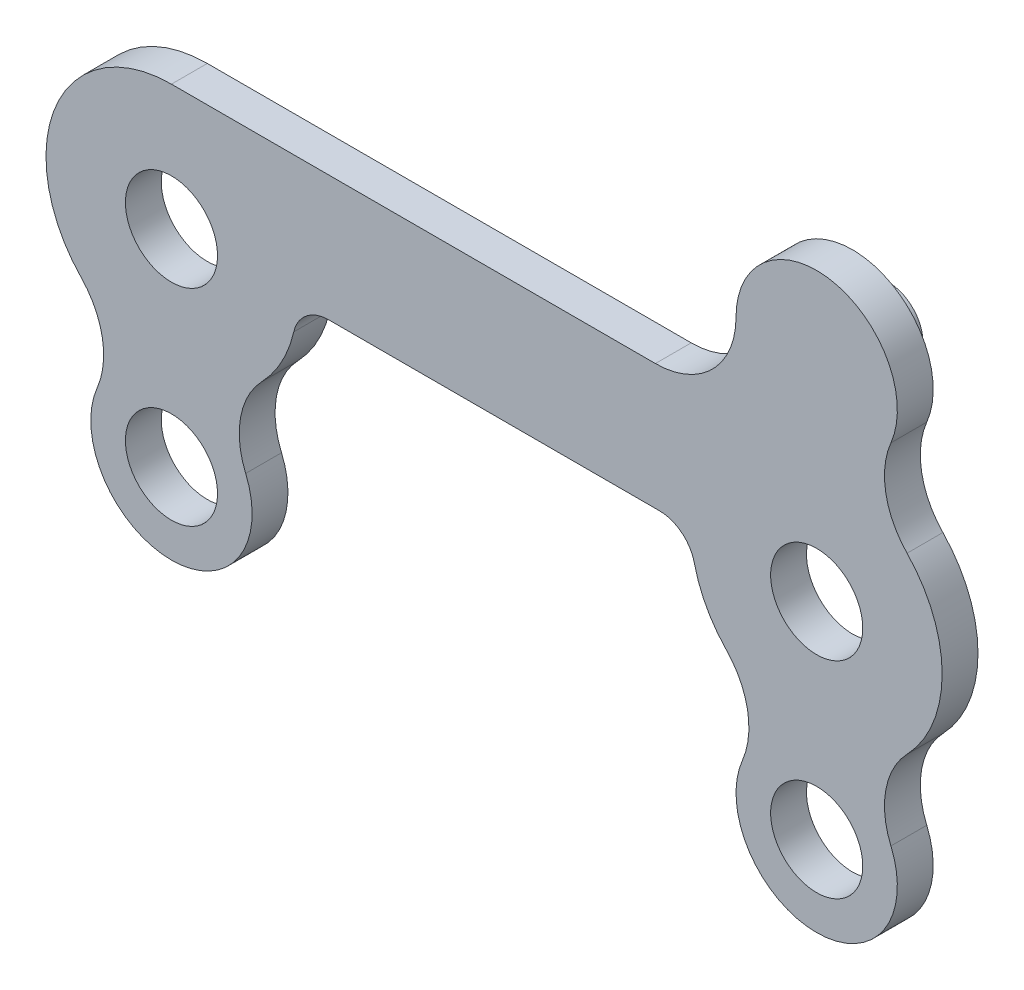
ISO-10303-21;
HEADER;
FILE_DESCRIPTION(('STEP AP214'),'2;1');
FILE_NAME('part.step','',(''),(''),'','','');
FILE_SCHEMA(('AUTOMOTIVE_DESIGN { 1 0 10303 214 1 1 1 1 }'));
ENDSEC;
DATA;
#1=APPLICATION_CONTEXT('core data for automotive mechanical design processes');
#2=APPLICATION_PROTOCOL_DEFINITION('international standard','automotive_design',2000,#1);
#3=PRODUCT_CONTEXT('',#1,'mechanical');
#4=PRODUCT('Part','Part','',(#3));
#5=PRODUCT_RELATED_PRODUCT_CATEGORY('part','',(#4));
#6=PRODUCT_DEFINITION_FORMATION('','',#4);
#7=PRODUCT_DEFINITION_CONTEXT('part definition',#1,'design');
#8=PRODUCT_DEFINITION('design','',#6,#7);
#9=PRODUCT_DEFINITION_SHAPE('','',#8);
#10=(LENGTH_UNIT() NAMED_UNIT(*) SI_UNIT(.MILLI.,.METRE.));
#11=(NAMED_UNIT(*) PLANE_ANGLE_UNIT() SI_UNIT($,.RADIAN.));
#12=(NAMED_UNIT(*) SI_UNIT($,.STERADIAN.) SOLID_ANGLE_UNIT());
#13=UNCERTAINTY_MEASURE_WITH_UNIT(LENGTH_MEASURE(1.E-05),#10,'distance_accuracy_value','');
#14=(GEOMETRIC_REPRESENTATION_CONTEXT(3) GLOBAL_UNCERTAINTY_ASSIGNED_CONTEXT((#13)) GLOBAL_UNIT_ASSIGNED_CONTEXT((#10,
#11,#12)) REPRESENTATION_CONTEXT('',''));
#15=CARTESIAN_POINT('',(0.,0.,0.));
#16=DIRECTION('',(0.,0.,1.));
#17=DIRECTION('',(1.,0.,0.));
#18=AXIS2_PLACEMENT_3D('',#15,#16,#17);
#19=CARTESIAN_POINT('',(35.149116844667,6.33274456521739,1.5875));
#20=DIRECTION('',(0.,0.,-1.));
#21=DIRECTION('',(-1.,0.,0.));
#22=AXIS2_PLACEMENT_3D('',#19,#20,#21);
#23=CYLINDRICAL_SURFACE('',#22,3.571875);
#24=CARTESIAN_POINT('',(35.149116844667,6.33274456521739,0.));
#25=DIRECTION('',(0.,0.,1.));
#26=DIRECTION('',(1.,0.,0.));
#27=AXIS2_PLACEMENT_3D('',#24,#25,#26);
#28=CIRCLE('',#27,3.571875);
#29=CARTESIAN_POINT('',(31.8620584223335,7.73043478260869,0.));
#30=VERTEX_POINT('',#29);
#31=CARTESIAN_POINT('',(32.5766363402321,3.8547140831758,0.));
#32=VERTEX_POINT('',#31);
#33=EDGE_CURVE('E165',#30,#32,#28,.T.);
#34=ORIENTED_EDGE('',*,*,#33,.F.);
#35=DIRECTION('',(0.,0.,-1.));
#36=VECTOR('',#35,1.);
#37=CARTESIAN_POINT('',(31.8620584223335,7.73043478260869,1.5875));
#38=LINE('',#37,#36);
#39=CARTESIAN_POINT('',(31.8620584223335,7.73043478260869,1.5875));
#40=VERTEX_POINT('',#39);
#41=EDGE_CURVE('E160',#40,#30,#38,.T.);
#42=ORIENTED_EDGE('',*,*,#41,.F.);
#43=CARTESIAN_POINT('',(35.149116844667,6.33274456521739,1.5875));
#44=DIRECTION('',(0.,0.,1.));
#45=DIRECTION('',(1.,0.,0.));
#46=AXIS2_PLACEMENT_3D('',#43,#44,#45);
#47=CIRCLE('',#46,3.571875);
#48=CARTESIAN_POINT('',(32.5766363402321,3.8547140831758,1.5875));
#49=VERTEX_POINT('',#48);
#50=EDGE_CURVE('E163',#40,#49,#47,.T.);
#51=ORIENTED_EDGE('',*,*,#50,.T.);
#52=DIRECTION('',(0.,0.,-1.));
#53=VECTOR('',#52,1.);
#54=CARTESIAN_POINT('',(32.5766363402321,3.8547140831758,1.5875));
#55=LINE('',#54,#53);
#56=EDGE_CURVE('E254',#49,#32,#55,.T.);
#57=ORIENTED_EDGE('',*,*,#56,.T.);
#58=EDGE_LOOP('',(#34,#42,#51,#57));
#59=FACE_BOUND('',#58,.T.);
#60=ADVANCED_FACE('F40',(#59),#23,.F.);
#61=CARTESIAN_POINT('',(28.575,9.128125,1.5875));
#62=DIRECTION('',(0.,0.,-1.));
#63=DIRECTION('',(-1.,0.,0.));
#64=AXIS2_PLACEMENT_3D('',#61,#62,#63);
#65=CYLINDRICAL_SURFACE('',#64,3.571875);
#66=CARTESIAN_POINT('',(28.575,9.128125,0.));
#67=DIRECTION('',(0.,0.,1.));
#68=DIRECTION('',(1.,0.,0.));
#69=AXIS2_PLACEMENT_3D('',#66,#67,#68);
#70=CIRCLE('',#69,3.571875);
#71=CARTESIAN_POINT('',(25.003125,9.128125,0.));
#72=VERTEX_POINT('',#71);
#73=EDGE_CURVE('E257',#30,#72,#70,.T.);
#74=ORIENTED_EDGE('',*,*,#73,.T.);
#75=DIRECTION('',(0.,0.,-1.));
#76=VECTOR('',#75,1.);
#77=CARTESIAN_POINT('',(25.003125,9.128125,1.5875));
#78=LINE('',#77,#76);
#79=CARTESIAN_POINT('',(25.003125,9.128125,1.5875));
#80=VERTEX_POINT('',#79);
#81=EDGE_CURVE('E171',#80,#72,#78,.T.);
#82=ORIENTED_EDGE('',*,*,#81,.F.);
#83=CARTESIAN_POINT('',(28.575,9.128125,1.5875));
#84=DIRECTION('',(0.,0.,1.));
#85=DIRECTION('',(1.,0.,0.));
#86=AXIS2_PLACEMENT_3D('',#83,#84,#85);
#87=CIRCLE('',#86,3.571875);
#88=EDGE_CURVE('E174',#40,#80,#87,.T.);
#89=ORIENTED_EDGE('',*,*,#88,.F.);
#90=ORIENTED_EDGE('',*,*,#41,.T.);
#91=EDGE_LOOP('',(#74,#82,#89,#90));
#92=FACE_BOUND('',#91,.T.);
#93=ADVANCED_FACE('F175',(#92),#65,.T.);
#94=CARTESIAN_POINT('',(21.43125,9.128125,1.5875));
#95=DIRECTION('',(0.,0.,-1.));
#96=DIRECTION('',(-1.,0.,0.));
#97=AXIS2_PLACEMENT_3D('',#94,#95,#96);
#98=CYLINDRICAL_SURFACE('',#97,3.571875);
#99=CARTESIAN_POINT('',(21.43125,9.128125,0.));
#100=DIRECTION('',(0.,0.,1.));
#101=DIRECTION('',(1.,0.,0.));
#102=AXIS2_PLACEMENT_3D('',#99,#100,#101);
#103=CIRCLE('',#102,3.571875);
#104=CARTESIAN_POINT('',(21.43125,5.55625,0.));
#105=VERTEX_POINT('',#104);
#106=EDGE_CURVE('E260',#105,#72,#103,.T.);
#107=ORIENTED_EDGE('',*,*,#106,.F.);
#108=DIRECTION('',(0.,0.,-1.));
#109=VECTOR('',#108,1.);
#110=CARTESIAN_POINT('',(21.43125,5.55625,1.5875));
#111=LINE('',#110,#109);
#112=CARTESIAN_POINT('',(21.43125,5.55625,1.5875));
#113=VERTEX_POINT('',#112);
#114=EDGE_CURVE('E346',#113,#105,#111,.T.);
#115=ORIENTED_EDGE('',*,*,#114,.F.);
#116=CARTESIAN_POINT('',(21.43125,9.128125,1.5875));
#117=DIRECTION('',(0.,0.,1.));
#118=DIRECTION('',(1.,0.,0.));
#119=AXIS2_PLACEMENT_3D('',#116,#117,#118);
#120=CIRCLE('',#119,3.571875);
#121=EDGE_CURVE('E180',#113,#80,#120,.T.);
#122=ORIENTED_EDGE('',*,*,#121,.T.);
#123=ORIENTED_EDGE('',*,*,#81,.T.);
#124=EDGE_LOOP('',(#107,#115,#122,#123));
#125=FACE_BOUND('',#124,.T.);
#126=ADVANCED_FACE('F411',(#125),#98,.F.);
#127=CARTESIAN_POINT('',(0.,5.55625,1.5875));
#128=DIRECTION('',(0.,1.,0.));
#129=DIRECTION('',(0.,0.,1.));
#130=AXIS2_PLACEMENT_3D('',#127,#128,#129);
#131=PLANE('',#130);
#132=DIRECTION('',(1.,0.,0.));
#133=VECTOR('',#132,1.);
#134=CARTESIAN_POINT('',(0.,5.55625,0.));
#135=LINE('',#134,#133);
#136=CARTESIAN_POINT('',(0.,5.55625,0.));
#137=VERTEX_POINT('',#136);
#138=EDGE_CURVE('E264',#137,#105,#135,.T.);
#139=ORIENTED_EDGE('',*,*,#138,.F.);
#140=DIRECTION('',(0.,0.,-1.));
#141=VECTOR('',#140,1.);
#142=CARTESIAN_POINT('',(0.,5.55625,1.5875));
#143=LINE('',#142,#141);
#144=CARTESIAN_POINT('',(0.,5.55625,1.5875));
#145=VERTEX_POINT('',#144);
#146=EDGE_CURVE('E343',#145,#137,#143,.T.);
#147=ORIENTED_EDGE('',*,*,#146,.F.);
#148=DIRECTION('',(1.,0.,0.));
#149=VECTOR('',#148,1.);
#150=CARTESIAN_POINT('',(0.,5.55625,1.5875));
#151=LINE('',#150,#149);
#152=EDGE_CURVE('E201',#145,#113,#151,.T.);
#153=ORIENTED_EDGE('',*,*,#152,.T.);
#154=ORIENTED_EDGE('',*,*,#114,.T.);
#155=EDGE_LOOP('',(#139,#147,#153,#154));
#156=FACE_BOUND('',#155,.T.);
#157=ADVANCED_FACE('F414',(#156),#131,.T.);
#158=CARTESIAN_POINT('',(0.,0.,1.5875));
#159=DIRECTION('',(0.,0.,-1.));
#160=DIRECTION('',(-1.,0.,0.));
#161=AXIS2_PLACEMENT_3D('',#158,#159,#160);
#162=CYLINDRICAL_SURFACE('',#161,5.55625);
#163=CARTESIAN_POINT('',(0.,0.,0.));
#164=DIRECTION('',(0.,0.,1.));
#165=DIRECTION('',(1.,0.,0.));
#166=AXIS2_PLACEMENT_3D('',#163,#164,#165);
#167=CIRCLE('',#166,5.55625);
#168=CARTESIAN_POINT('',(-4.0016363402321,-3.8547140831758,0.));
#169=VERTEX_POINT('',#168);
#170=EDGE_CURVE('E268',#137,#169,#167,.T.);
#171=ORIENTED_EDGE('',*,*,#170,.T.);
#172=DIRECTION('',(0.,0.,-1.));
#173=VECTOR('',#172,1.);
#174=CARTESIAN_POINT('',(-4.0016363402321,-3.8547140831758,1.5875));
#175=LINE('',#174,#173);
#176=CARTESIAN_POINT('',(-4.0016363402321,-3.8547140831758,1.5875));
#177=VERTEX_POINT('',#176);
#178=EDGE_CURVE('E340',#177,#169,#175,.T.);
#179=ORIENTED_EDGE('',*,*,#178,.F.);
#180=CARTESIAN_POINT('',(0.,0.,1.5875));
#181=DIRECTION('',(0.,0.,1.));
#182=DIRECTION('',(1.,0.,0.));
#183=AXIS2_PLACEMENT_3D('',#180,#181,#182);
#184=CIRCLE('',#183,5.55625);
#185=EDGE_CURVE('E205',#145,#177,#184,.T.);
#186=ORIENTED_EDGE('',*,*,#185,.F.);
#187=ORIENTED_EDGE('',*,*,#146,.T.);
#188=EDGE_LOOP('',(#171,#179,#186,#187));
#189=FACE_BOUND('',#188,.T.);
#190=ADVANCED_FACE('F418',(#189),#162,.T.);
#191=CARTESIAN_POINT('',(-6.57411684466701,-6.33274456521738,1.5875));
#192=DIRECTION('',(0.,0.,-1.));
#193=DIRECTION('',(-1.,0.,0.));
#194=AXIS2_PLACEMENT_3D('',#191,#192,#193);
#195=CYLINDRICAL_SURFACE('',#194,3.571875);
#196=CARTESIAN_POINT('',(-6.57411684466701,-6.33274456521738,0.));
#197=DIRECTION('',(0.,0.,1.));
#198=DIRECTION('',(1.,0.,0.));
#199=AXIS2_PLACEMENT_3D('',#196,#197,#198);
#200=CIRCLE('',#199,3.571875);
#201=CARTESIAN_POINT('',(-3.28705842233351,-7.73043478260869,0.));
#202=VERTEX_POINT('',#201);
#203=EDGE_CURVE('E272',#202,#169,#200,.T.);
#204=ORIENTED_EDGE('',*,*,#203,.F.);
#205=DIRECTION('',(0.,0.,-1.));
#206=VECTOR('',#205,1.);
#207=CARTESIAN_POINT('',(-3.28705842233351,-7.73043478260869,1.5875));
#208=LINE('',#207,#206);
#209=CARTESIAN_POINT('',(-3.28705842233351,-7.73043478260869,1.5875));
#210=VERTEX_POINT('',#209);
#211=EDGE_CURVE('E337',#210,#202,#208,.T.);
#212=ORIENTED_EDGE('',*,*,#211,.F.);
#213=CARTESIAN_POINT('',(-6.57411684466701,-6.33274456521738,1.5875));
#214=DIRECTION('',(0.,0.,1.));
#215=DIRECTION('',(1.,0.,0.));
#216=AXIS2_PLACEMENT_3D('',#213,#214,#215);
#217=CIRCLE('',#216,3.571875);
#218=EDGE_CURVE('E208',#210,#177,#217,.T.);
#219=ORIENTED_EDGE('',*,*,#218,.T.);
#220=ORIENTED_EDGE('',*,*,#178,.T.);
#221=EDGE_LOOP('',(#204,#212,#219,#220));
#222=FACE_BOUND('',#221,.T.);
#223=ADVANCED_FACE('F424',(#222),#195,.F.);
#224=CARTESIAN_POINT('',(0.,-9.128125,1.5875));
#225=DIRECTION('',(0.,0.,-1.));
#226=DIRECTION('',(-1.,0.,0.));
#227=AXIS2_PLACEMENT_3D('',#224,#225,#226);
#228=CYLINDRICAL_SURFACE('',#227,3.571875);
#229=CARTESIAN_POINT('',(0.,-9.128125,0.));
#230=DIRECTION('',(0.,0.,1.));
#231=DIRECTION('',(1.,0.,0.));
#232=AXIS2_PLACEMENT_3D('',#229,#230,#231);
#233=CIRCLE('',#232,3.571875);
#234=CARTESIAN_POINT('',(3.28705842233351,-7.73043478260869,0.));
#235=VERTEX_POINT('',#234);
#236=EDGE_CURVE('E277',#202,#235,#233,.T.);
#237=ORIENTED_EDGE('',*,*,#236,.T.);
#238=DIRECTION('',(0.,0.,-1.));
#239=VECTOR('',#238,1.);
#240=CARTESIAN_POINT('',(3.28705842233351,-7.73043478260869,1.5875));
#241=LINE('',#240,#239);
#242=CARTESIAN_POINT('',(3.28705842233351,-7.73043478260869,1.5875));
#243=VERTEX_POINT('',#242);
#244=EDGE_CURVE('E334',#243,#235,#241,.T.);
#245=ORIENTED_EDGE('',*,*,#244,.F.);
#246=CARTESIAN_POINT('',(0.,-9.128125,1.5875));
#247=DIRECTION('',(0.,0.,1.));
#248=DIRECTION('',(1.,0.,0.));
#249=AXIS2_PLACEMENT_3D('',#246,#247,#248);
#250=CIRCLE('',#249,3.571875);
#251=EDGE_CURVE('E213',#210,#243,#250,.T.);
#252=ORIENTED_EDGE('',*,*,#251,.F.);
#253=ORIENTED_EDGE('',*,*,#211,.T.);
#254=EDGE_LOOP('',(#237,#245,#252,#253));
#255=FACE_BOUND('',#254,.T.);
#256=ADVANCED_FACE('F427',(#255),#228,.T.);
#257=CARTESIAN_POINT('',(6.57411684466701,-6.33274456521738,1.5875));
#258=DIRECTION('',(0.,0.,-1.));
#259=DIRECTION('',(-1.,0.,0.));
#260=AXIS2_PLACEMENT_3D('',#257,#258,#259);
#261=CYLINDRICAL_SURFACE('',#260,3.571875);
#262=CARTESIAN_POINT('',(6.57411684466701,-6.33274456521738,0.));
#263=DIRECTION('',(0.,0.,1.));
#264=DIRECTION('',(1.,0.,0.));
#265=AXIS2_PLACEMENT_3D('',#262,#263,#264);
#266=CIRCLE('',#265,3.571875);
#267=CARTESIAN_POINT('',(4.0016363402321,-3.8547140831758,0.));
#268=VERTEX_POINT('',#267);
#269=EDGE_CURVE('E281',#268,#235,#266,.T.);
#270=ORIENTED_EDGE('',*,*,#269,.F.);
#271=DIRECTION('',(0.,0.,-1.));
#272=VECTOR('',#271,1.);
#273=CARTESIAN_POINT('',(4.0016363402321,-3.8547140831758,1.5875));
#274=LINE('',#273,#272);
#275=CARTESIAN_POINT('',(4.0016363402321,-3.8547140831758,1.5875));
#276=VERTEX_POINT('',#275);
#277=EDGE_CURVE('E331',#276,#268,#274,.T.);
#278=ORIENTED_EDGE('',*,*,#277,.F.);
#279=CARTESIAN_POINT('',(6.57411684466701,-6.33274456521738,1.5875));
#280=DIRECTION('',(0.,0.,1.));
#281=DIRECTION('',(1.,0.,0.));
#282=AXIS2_PLACEMENT_3D('',#279,#280,#281);
#283=CIRCLE('',#282,3.571875);
#284=EDGE_CURVE('E216',#276,#243,#283,.T.);
#285=ORIENTED_EDGE('',*,*,#284,.T.);
#286=ORIENTED_EDGE('',*,*,#244,.T.);
#287=EDGE_LOOP('',(#270,#278,#285,#286));
#288=FACE_BOUND('',#287,.T.);
#289=ADVANCED_FACE('F430',(#288),#261,.F.);
#290=CARTESIAN_POINT('',(5.41732176416083,-1.23472222222222,0.));
#291=VERTEX_POINT('',#290);
#292=EDGE_CURVE('E273',#268,#291,#167,.T.);
#293=ORIENTED_EDGE('',*,*,#292,.T.);
#294=DIRECTION('',(0.,0.,-1.));
#295=VECTOR('',#294,1.);
#296=CARTESIAN_POINT('',(5.41732176416083,-1.23472222222222,1.5875));
#297=LINE('',#296,#295);
#298=CARTESIAN_POINT('',(5.41732176416083,-1.23472222222222,1.5875));
#299=VERTEX_POINT('',#298);
#300=EDGE_CURVE('E56',#291,#299,#297,.F.);
#301=ORIENTED_EDGE('',*,*,#300,.T.);
#302=EDGE_CURVE('E209',#276,#299,#184,.T.);
#303=ORIENTED_EDGE('',*,*,#302,.F.);
#304=ORIENTED_EDGE('',*,*,#277,.T.);
#305=EDGE_LOOP('',(#293,#301,#303,#304));
#306=FACE_BOUND('',#305,.T.);
#307=ADVANCED_FACE('F431',(#306),#162,.T.);
#308=CARTESIAN_POINT('',(0.,0.,1.5875));
#309=DIRECTION('',(0.,1.,0.));
#310=DIRECTION('',(0.,0.,1.));
#311=AXIS2_PLACEMENT_3D('',#308,#309,#310);
#312=PLANE('',#311);
#313=DIRECTION('',(1.,0.,0.));
#314=VECTOR('',#313,1.);
#315=CARTESIAN_POINT('',(0.,0.,0.));
#316=LINE('',#315,#314);
#317=CARTESIAN_POINT('',(6.9651279824925,0.,0.));
#318=VERTEX_POINT('',#317);
#319=CARTESIAN_POINT('',(21.6098720175075,0.,0.));
#320=VERTEX_POINT('',#319);
#321=EDGE_CURVE('E285',#318,#320,#316,.T.);
#322=ORIENTED_EDGE('',*,*,#321,.T.);
#323=DIRECTION('',(0.,0.,1.));
#324=VECTOR('',#323,1.);
#325=CARTESIAN_POINT('',(21.6098720175075,0.,1.5875));
#326=LINE('',#325,#324);
#327=CARTESIAN_POINT('',(21.6098720175075,0.,1.5875));
#328=VERTEX_POINT('',#327);
#329=EDGE_CURVE('E358',#320,#328,#326,.T.);
#330=ORIENTED_EDGE('',*,*,#329,.T.);
#331=DIRECTION('',(1.,0.,0.));
#332=VECTOR('',#331,1.);
#333=CARTESIAN_POINT('',(0.,0.,1.5875));
#334=LINE('',#333,#332);
#335=CARTESIAN_POINT('',(6.9651279824925,0.,1.5875));
#336=VERTEX_POINT('',#335);
#337=EDGE_CURVE('E220',#336,#328,#334,.T.);
#338=ORIENTED_EDGE('',*,*,#337,.F.);
#339=DIRECTION('',(0.,0.,1.));
#340=VECTOR('',#339,1.);
#341=CARTESIAN_POINT('',(6.9651279824925,0.,0.));
#342=LINE('',#341,#340);
#343=EDGE_CURVE('E354',#336,#318,#342,.F.);
#344=ORIENTED_EDGE('',*,*,#343,.T.);
#345=EDGE_LOOP('',(#322,#330,#338,#344));
#346=FACE_BOUND('',#345,.T.);
#347=ADVANCED_FACE('F377',(#346),#312,.F.);
#348=CARTESIAN_POINT('',(28.575,0.,1.5875));
#349=DIRECTION('',(0.,0.,-1.));
#350=DIRECTION('',(-1.,0.,0.));
#351=AXIS2_PLACEMENT_3D('',#348,#349,#350);
#352=CYLINDRICAL_SURFACE('',#351,5.55625);
#353=CARTESIAN_POINT('',(28.575,0.,1.5875));
#354=DIRECTION('',(0.,0.,1.));
#355=DIRECTION('',(1.,0.,0.));
#356=AXIS2_PLACEMENT_3D('',#353,#354,#355);
#357=CIRCLE('',#356,5.55625);
#358=CARTESIAN_POINT('',(23.1576782358392,-1.23472222222222,1.5875));
#359=VERTEX_POINT('',#358);
#360=CARTESIAN_POINT('',(24.5733636597679,-3.8547140831758,1.5875));
#361=VERTEX_POINT('',#360);
#362=EDGE_CURVE('E224',#359,#361,#357,.T.);
#363=ORIENTED_EDGE('',*,*,#362,.F.);
#364=DIRECTION('',(0.,0.,-1.));
#365=VECTOR('',#364,1.);
#366=CARTESIAN_POINT('',(23.1576782358392,-1.23472222222222,1.5875));
#367=LINE('',#366,#365);
#368=CARTESIAN_POINT('',(23.1576782358392,-1.23472222222222,0.));
#369=VERTEX_POINT('',#368);
#370=EDGE_CURVE('E170',#359,#369,#367,.T.);
#371=ORIENTED_EDGE('',*,*,#370,.T.);
#372=CARTESIAN_POINT('',(28.575,0.,0.));
#373=DIRECTION('',(0.,0.,1.));
#374=DIRECTION('',(1.,0.,0.));
#375=AXIS2_PLACEMENT_3D('',#372,#373,#374);
#376=CIRCLE('',#375,5.55625);
#377=CARTESIAN_POINT('',(24.5733636597679,-3.8547140831758,0.));
#378=VERTEX_POINT('',#377);
#379=EDGE_CURVE('E289',#369,#378,#376,.T.);
#380=ORIENTED_EDGE('',*,*,#379,.T.);
#381=DIRECTION('',(0.,0.,-1.));
#382=VECTOR('',#381,1.);
#383=CARTESIAN_POINT('',(24.5733636597679,-3.8547140831758,1.5875));
#384=LINE('',#383,#382);
#385=EDGE_CURVE('E327',#361,#378,#384,.T.);
#386=ORIENTED_EDGE('',*,*,#385,.F.);
#387=EDGE_LOOP('',(#363,#371,#380,#386));
#388=FACE_BOUND('',#387,.T.);
#389=ADVANCED_FACE('F388',(#388),#352,.T.);
#390=CARTESIAN_POINT('',(22.000883155333,-6.33274456521739,1.5875));
#391=DIRECTION('',(0.,0.,-1.));
#392=DIRECTION('',(-1.,0.,0.));
#393=AXIS2_PLACEMENT_3D('',#390,#391,#392);
#394=CYLINDRICAL_SURFACE('',#393,3.571875);
#395=CARTESIAN_POINT('',(22.000883155333,-6.33274456521739,0.));
#396=DIRECTION('',(0.,0.,1.));
#397=DIRECTION('',(1.,0.,0.));
#398=AXIS2_PLACEMENT_3D('',#395,#396,#397);
#399=CIRCLE('',#398,3.571875);
#400=CARTESIAN_POINT('',(25.2879415776665,-7.7304347826087,0.));
#401=VERTEX_POINT('',#400);
#402=EDGE_CURVE('E292',#401,#378,#399,.T.);
#403=ORIENTED_EDGE('',*,*,#402,.F.);
#404=DIRECTION('',(0.,0.,-1.));
#405=VECTOR('',#404,1.);
#406=CARTESIAN_POINT('',(25.2879415776665,-7.7304347826087,1.5875));
#407=LINE('',#406,#405);
#408=CARTESIAN_POINT('',(25.2879415776665,-7.7304347826087,1.5875));
#409=VERTEX_POINT('',#408);
#410=EDGE_CURVE('E324',#409,#401,#407,.T.);
#411=ORIENTED_EDGE('',*,*,#410,.F.);
#412=CARTESIAN_POINT('',(22.000883155333,-6.33274456521739,1.5875));
#413=DIRECTION('',(0.,0.,1.));
#414=DIRECTION('',(1.,0.,0.));
#415=AXIS2_PLACEMENT_3D('',#412,#413,#414);
#416=CIRCLE('',#415,3.571875);
#417=EDGE_CURVE('E227',#409,#361,#416,.T.);
#418=ORIENTED_EDGE('',*,*,#417,.T.);
#419=ORIENTED_EDGE('',*,*,#385,.T.);
#420=EDGE_LOOP('',(#403,#411,#418,#419));
#421=FACE_BOUND('',#420,.T.);
#422=ADVANCED_FACE('F395',(#421),#394,.F.);
#423=CARTESIAN_POINT('',(28.575,-9.128125,1.5875));
#424=DIRECTION('',(0.,0.,-1.));
#425=DIRECTION('',(-1.,0.,0.));
#426=AXIS2_PLACEMENT_3D('',#423,#424,#425);
#427=CYLINDRICAL_SURFACE('',#426,3.57187499999999);
#428=CARTESIAN_POINT('',(28.575,-9.128125,0.));
#429=DIRECTION('',(0.,0.,1.));
#430=DIRECTION('',(1.,0.,0.));
#431=AXIS2_PLACEMENT_3D('',#428,#429,#430);
#432=CIRCLE('',#431,3.57187499999999);
#433=CARTESIAN_POINT('',(31.8620584223335,-7.73043478260869,0.));
#434=VERTEX_POINT('',#433);
#435=EDGE_CURVE('E297',#401,#434,#432,.T.);
#436=ORIENTED_EDGE('',*,*,#435,.T.);
#437=DIRECTION('',(0.,0.,-1.));
#438=VECTOR('',#437,1.);
#439=CARTESIAN_POINT('',(31.8620584223335,-7.73043478260869,1.5875));
#440=LINE('',#439,#438);
#441=CARTESIAN_POINT('',(31.8620584223335,-7.73043478260869,1.5875));
#442=VERTEX_POINT('',#441);
#443=EDGE_CURVE('E321',#442,#434,#440,.T.);
#444=ORIENTED_EDGE('',*,*,#443,.F.);
#445=CARTESIAN_POINT('',(28.575,-9.128125,1.5875));
#446=DIRECTION('',(0.,0.,1.));
#447=DIRECTION('',(1.,0.,0.));
#448=AXIS2_PLACEMENT_3D('',#445,#446,#447);
#449=CIRCLE('',#448,3.57187499999999);
#450=EDGE_CURVE('E231',#409,#442,#449,.T.);
#451=ORIENTED_EDGE('',*,*,#450,.F.);
#452=ORIENTED_EDGE('',*,*,#410,.T.);
#453=EDGE_LOOP('',(#436,#444,#451,#452));
#454=FACE_BOUND('',#453,.T.);
#455=ADVANCED_FACE('F398',(#454),#427,.T.);
#456=CARTESIAN_POINT('',(35.149116844667,-6.33274456521738,1.5875));
#457=DIRECTION('',(0.,0.,-1.));
#458=DIRECTION('',(-1.,0.,0.));
#459=AXIS2_PLACEMENT_3D('',#456,#457,#458);
#460=CYLINDRICAL_SURFACE('',#459,3.57187499999999);
#461=CARTESIAN_POINT('',(35.149116844667,-6.33274456521738,0.));
#462=DIRECTION('',(0.,0.,1.));
#463=DIRECTION('',(1.,0.,0.));
#464=AXIS2_PLACEMENT_3D('',#461,#462,#463);
#465=CIRCLE('',#464,3.57187499999999);
#466=CARTESIAN_POINT('',(32.5766363402321,-3.8547140831758,0.));
#467=VERTEX_POINT('',#466);
#468=EDGE_CURVE('E301',#467,#434,#465,.T.);
#469=ORIENTED_EDGE('',*,*,#468,.F.);
#470=DIRECTION('',(0.,0.,-1.));
#471=VECTOR('',#470,1.);
#472=CARTESIAN_POINT('',(32.5766363402321,-3.8547140831758,1.5875));
#473=LINE('',#472,#471);
#474=CARTESIAN_POINT('',(32.5766363402321,-3.8547140831758,1.5875));
#475=VERTEX_POINT('',#474);
#476=EDGE_CURVE('E318',#475,#467,#473,.T.);
#477=ORIENTED_EDGE('',*,*,#476,.F.);
#478=CARTESIAN_POINT('',(35.149116844667,-6.33274456521738,1.5875));
#479=DIRECTION('',(0.,0.,1.));
#480=DIRECTION('',(1.,0.,0.));
#481=AXIS2_PLACEMENT_3D('',#478,#479,#480);
#482=CIRCLE('',#481,3.57187499999999);
#483=EDGE_CURVE('E234',#475,#442,#482,.T.);
#484=ORIENTED_EDGE('',*,*,#483,.T.);
#485=ORIENTED_EDGE('',*,*,#443,.T.);
#486=EDGE_LOOP('',(#469,#477,#484,#485));
#487=FACE_BOUND('',#486,.T.);
#488=ADVANCED_FACE('F401',(#487),#460,.F.);
#489=CARTESIAN_POINT('',(0.,-9.128125,1.5875));
#490=DIRECTION('',(0.,0.,-1.));
#491=DIRECTION('',(-1.,0.,0.));
#492=AXIS2_PLACEMENT_3D('',#489,#490,#491);
#493=CYLINDRICAL_SURFACE('',#492,2.0399375);
#494=CARTESIAN_POINT('',(0.,-9.128125,1.5875));
#495=DIRECTION('',(0.,0.,1.));
#496=DIRECTION('',(1.,0.,0.));
#497=AXIS2_PLACEMENT_3D('',#494,#495,#496);
#498=CIRCLE('',#497,2.0399375);
#499=CARTESIAN_POINT('',(2.0399375,-9.128125,1.5875));
#500=VERTEX_POINT('',#499);
#501=EDGE_CURVE('E246',#500,#500,#498,.T.);
#502=ORIENTED_EDGE('',*,*,#501,.T.);
#503=EDGE_LOOP('',(#502));
#504=FACE_BOUND('',#503,.T.);
#505=CARTESIAN_POINT('',(0.,-9.128125,0.));
#506=DIRECTION('',(0.,0.,1.));
#507=DIRECTION('',(1.,0.,0.));
#508=AXIS2_PLACEMENT_3D('',#505,#506,#507);
#509=CIRCLE('',#508,2.0399375);
#510=CARTESIAN_POINT('',(2.0399375,-9.128125,0.));
#511=VERTEX_POINT('',#510);
#512=EDGE_CURVE('E193',#511,#511,#509,.T.);
#513=ORIENTED_EDGE('',*,*,#512,.F.);
#514=EDGE_LOOP('',(#513));
#515=FACE_BOUND('',#514,.T.);
#516=ADVANCED_FACE('F547',(#504,#515),#493,.F.);
#517=CARTESIAN_POINT('',(28.575,0.,1.5875));
#518=DIRECTION('',(0.,0.,-1.));
#519=DIRECTION('',(-1.,0.,0.));
#520=AXIS2_PLACEMENT_3D('',#517,#518,#519);
#521=CYLINDRICAL_SURFACE('',#520,2.0399375);
#522=CARTESIAN_POINT('',(28.575,0.,1.5875));
#523=DIRECTION('',(0.,0.,1.));
#524=DIRECTION('',(1.,0.,0.));
#525=AXIS2_PLACEMENT_3D('',#522,#523,#524);
#526=CIRCLE('',#525,2.0399375);
#527=CARTESIAN_POINT('',(30.6149375,0.,1.5875));
#528=VERTEX_POINT('',#527);
#529=EDGE_CURVE('E242',#528,#528,#526,.T.);
#530=ORIENTED_EDGE('',*,*,#529,.T.);
#531=EDGE_LOOP('',(#530));
#532=FACE_BOUND('',#531,.T.);
#533=CARTESIAN_POINT('',(28.575,0.,0.));
#534=DIRECTION('',(0.,0.,1.));
#535=DIRECTION('',(1.,0.,0.));
#536=AXIS2_PLACEMENT_3D('',#533,#534,#535);
#537=CIRCLE('',#536,2.0399375);
#538=CARTESIAN_POINT('',(30.6149375,0.,0.));
#539=VERTEX_POINT('',#538);
#540=EDGE_CURVE('E309',#539,#539,#537,.T.);
#541=ORIENTED_EDGE('',*,*,#540,.F.);
#542=EDGE_LOOP('',(#541));
#543=FACE_BOUND('',#542,.T.);
#544=ADVANCED_FACE('F537',(#532,#543),#521,.F.);
#545=CARTESIAN_POINT('',(0.,0.,1.5875));
#546=DIRECTION('',(0.,0.,-1.));
#547=DIRECTION('',(-1.,0.,0.));
#548=AXIS2_PLACEMENT_3D('',#545,#546,#547);
#549=CYLINDRICAL_SURFACE('',#548,2.0399375);
#550=CARTESIAN_POINT('',(0.,0.,1.5875));
#551=DIRECTION('',(0.,0.,1.));
#552=DIRECTION('',(1.,0.,0.));
#553=AXIS2_PLACEMENT_3D('',#550,#551,#552);
#554=CIRCLE('',#553,2.0399375);
#555=CARTESIAN_POINT('',(2.0399375,0.,1.5875));
#556=VERTEX_POINT('',#555);
#557=EDGE_CURVE('E238',#556,#556,#554,.T.);
#558=ORIENTED_EDGE('',*,*,#557,.T.);
#559=EDGE_LOOP('',(#558));
#560=FACE_BOUND('',#559,.T.);
#561=CARTESIAN_POINT('',(0.,0.,0.));
#562=DIRECTION('',(0.,0.,1.));
#563=DIRECTION('',(1.,0.,0.));
#564=AXIS2_PLACEMENT_3D('',#561,#562,#563);
#565=CIRCLE('',#564,2.0399375);
#566=CARTESIAN_POINT('',(2.0399375,0.,0.));
#567=VERTEX_POINT('',#566);
#568=EDGE_CURVE('E305',#567,#567,#565,.T.);
#569=ORIENTED_EDGE('',*,*,#568,.F.);
#570=EDGE_LOOP('',(#569));
#571=FACE_BOUND('',#570,.T.);
#572=ADVANCED_FACE('F529',(#560,#571),#549,.F.);
#573=EDGE_CURVE('E293',#467,#32,#376,.T.);
#574=ORIENTED_EDGE('',*,*,#573,.T.);
#575=ORIENTED_EDGE('',*,*,#56,.F.);
#576=EDGE_CURVE('E186',#475,#49,#357,.T.);
#577=ORIENTED_EDGE('',*,*,#576,.F.);
#578=ORIENTED_EDGE('',*,*,#476,.T.);
#579=EDGE_LOOP('',(#574,#575,#577,#578));
#580=FACE_BOUND('',#579,.T.);
#581=ADVANCED_FACE('F405',(#580),#352,.T.);
#582=CARTESIAN_POINT('',(28.575,-9.128125,1.5875));
#583=DIRECTION('',(0.,0.,-1.));
#584=DIRECTION('',(-1.,0.,0.));
#585=AXIS2_PLACEMENT_3D('',#582,#583,#584);
#586=CYLINDRICAL_SURFACE('',#585,2.0399375);
#587=CARTESIAN_POINT('',(28.575,-9.128125,1.5875));
#588=DIRECTION('',(0.,0.,1.));
#589=DIRECTION('',(1.,0.,0.));
#590=AXIS2_PLACEMENT_3D('',#587,#588,#589);
#591=CIRCLE('',#590,2.0399375);
#592=CARTESIAN_POINT('',(30.6149375,-9.128125,1.5875));
#593=VERTEX_POINT('',#592);
#594=EDGE_CURVE('E250',#593,#593,#591,.T.);
#595=ORIENTED_EDGE('',*,*,#594,.T.);
#596=EDGE_LOOP('',(#595));
#597=FACE_BOUND('',#596,.T.);
#598=CARTESIAN_POINT('',(28.575,-9.128125,0.));
#599=DIRECTION('',(0.,0.,1.));
#600=DIRECTION('',(1.,0.,0.));
#601=AXIS2_PLACEMENT_3D('',#598,#599,#600);
#602=CIRCLE('',#601,2.0399375);
#603=CARTESIAN_POINT('',(30.6149375,-9.128125,0.));
#604=VERTEX_POINT('',#603);
#605=EDGE_CURVE('E189',#604,#604,#602,.T.);
#606=ORIENTED_EDGE('',*,*,#605,.F.);
#607=EDGE_LOOP('',(#606));
#608=FACE_BOUND('',#607,.T.);
#609=ADVANCED_FACE('F482',(#597,#608),#586,.F.);
#610=CARTESIAN_POINT('',(0.,0.,1.5875));
#611=DIRECTION('',(0.,0.,1.));
#612=DIRECTION('',(1.,0.,0.));
#613=AXIS2_PLACEMENT_3D('',#610,#611,#612);
#614=PLANE('',#613);
#615=ORIENTED_EDGE('',*,*,#50,.F.);
#616=ORIENTED_EDGE('',*,*,#88,.T.);
#617=ORIENTED_EDGE('',*,*,#121,.F.);
#618=ORIENTED_EDGE('',*,*,#152,.F.);
#619=ORIENTED_EDGE('',*,*,#185,.T.);
#620=ORIENTED_EDGE('',*,*,#218,.F.);
#621=ORIENTED_EDGE('',*,*,#251,.T.);
#622=ORIENTED_EDGE('',*,*,#284,.F.);
#623=ORIENTED_EDGE('',*,*,#302,.T.);
#624=CARTESIAN_POINT('',(6.9651279824925,-1.5875,1.5875));
#625=DIRECTION('',(0.,0.,1.));
#626=DIRECTION('',(1.,0.,0.));
#627=AXIS2_PLACEMENT_3D('',#624,#625,#626);
#628=CIRCLE('',#627,1.5875);
#629=EDGE_CURVE('E11',#299,#336,#628,.F.);
#630=ORIENTED_EDGE('',*,*,#629,.T.);
#631=ORIENTED_EDGE('',*,*,#337,.T.);
#632=CARTESIAN_POINT('',(21.6098720175075,-1.5875,1.5875));
#633=DIRECTION('',(0.,0.,1.));
#634=DIRECTION('',(1.,0.,0.));
#635=AXIS2_PLACEMENT_3D('',#632,#633,#634);
#636=CIRCLE('',#635,1.5875);
#637=EDGE_CURVE('E366',#328,#359,#636,.F.);
#638=ORIENTED_EDGE('',*,*,#637,.T.);
#639=ORIENTED_EDGE('',*,*,#362,.T.);
#640=ORIENTED_EDGE('',*,*,#417,.F.);
#641=ORIENTED_EDGE('',*,*,#450,.T.);
#642=ORIENTED_EDGE('',*,*,#483,.F.);
#643=ORIENTED_EDGE('',*,*,#576,.T.);
#644=EDGE_LOOP('',(#615,#616,#617,#618,#619,#620,#621,#622,#623,#630,#631,#638,#639,#640,#641,
#642,#643));
#645=FACE_BOUND('',#644,.T.);
#646=ORIENTED_EDGE('',*,*,#557,.F.);
#647=EDGE_LOOP('',(#646));
#648=FACE_BOUND('',#647,.T.);
#649=ORIENTED_EDGE('',*,*,#529,.F.);
#650=EDGE_LOOP('',(#649));
#651=FACE_BOUND('',#650,.T.);
#652=ORIENTED_EDGE('',*,*,#501,.F.);
#653=EDGE_LOOP('',(#652));
#654=FACE_BOUND('',#653,.T.);
#655=ORIENTED_EDGE('',*,*,#594,.F.);
#656=EDGE_LOOP('',(#655));
#657=FACE_BOUND('',#656,.T.);
#658=ADVANCED_FACE('F182',(#645,#648,#651,#654,#657),#614,.T.);
#659=CARTESIAN_POINT('',(0.,0.,0.));
#660=DIRECTION('',(0.,0.,1.));
#661=DIRECTION('',(1.,0.,0.));
#662=AXIS2_PLACEMENT_3D('',#659,#660,#661);
#663=PLANE('',#662);
#664=ORIENTED_EDGE('',*,*,#33,.T.);
#665=ORIENTED_EDGE('',*,*,#573,.F.);
#666=ORIENTED_EDGE('',*,*,#468,.T.);
#667=ORIENTED_EDGE('',*,*,#435,.F.);
#668=ORIENTED_EDGE('',*,*,#402,.T.);
#669=ORIENTED_EDGE('',*,*,#379,.F.);
#670=CARTESIAN_POINT('',(21.6098720175075,-1.5875,0.));
#671=DIRECTION('',(0.,0.,1.));
#672=DIRECTION('',(1.,0.,0.));
#673=AXIS2_PLACEMENT_3D('',#670,#671,#672);
#674=CIRCLE('',#673,1.5875);
#675=EDGE_CURVE('E363',#369,#320,#674,.T.);
#676=ORIENTED_EDGE('',*,*,#675,.T.);
#677=ORIENTED_EDGE('',*,*,#321,.F.);
#678=CARTESIAN_POINT('',(6.9651279824925,-1.5875,0.));
#679=DIRECTION('',(0.,0.,1.));
#680=DIRECTION('',(1.,0.,0.));
#681=AXIS2_PLACEMENT_3D('',#678,#679,#680);
#682=CIRCLE('',#681,1.5875);
#683=EDGE_CURVE('E49',#318,#291,#682,.T.);
#684=ORIENTED_EDGE('',*,*,#683,.T.);
#685=ORIENTED_EDGE('',*,*,#292,.F.);
#686=ORIENTED_EDGE('',*,*,#269,.T.);
#687=ORIENTED_EDGE('',*,*,#236,.F.);
#688=ORIENTED_EDGE('',*,*,#203,.T.);
#689=ORIENTED_EDGE('',*,*,#170,.F.);
#690=ORIENTED_EDGE('',*,*,#138,.T.);
#691=ORIENTED_EDGE('',*,*,#106,.T.);
#692=ORIENTED_EDGE('',*,*,#73,.F.);
#693=EDGE_LOOP('',(#664,#665,#666,#667,#668,#669,#676,#677,#684,#685,#686,#687,#688,#689,#690,
#691,#692));
#694=FACE_BOUND('',#693,.T.);
#695=ORIENTED_EDGE('',*,*,#568,.T.);
#696=EDGE_LOOP('',(#695));
#697=FACE_BOUND('',#696,.T.);
#698=ORIENTED_EDGE('',*,*,#540,.T.);
#699=EDGE_LOOP('',(#698));
#700=FACE_BOUND('',#699,.T.);
#701=ORIENTED_EDGE('',*,*,#512,.T.);
#702=EDGE_LOOP('',(#701));
#703=FACE_BOUND('',#702,.T.);
#704=CARTESIAN_POINT('',(28.575,9.128125,0.));
#705=DIRECTION('',(0.,0.,1.));
#706=DIRECTION('',(1.,0.,0.));
#707=AXIS2_PLACEMENT_3D('',#704,#705,#706);
#708=CIRCLE('',#707,1.5319375);
#709=CARTESIAN_POINT('',(30.1069375,9.128125,0.));
#710=VERTEX_POINT('',#709);
#711=EDGE_CURVE('E196',#710,#710,#708,.T.);
#712=ORIENTED_EDGE('',*,*,#711,.T.);
#713=EDGE_LOOP('',(#712));
#714=FACE_BOUND('',#713,.T.);
#715=ORIENTED_EDGE('',*,*,#605,.T.);
#716=EDGE_LOOP('',(#715));
#717=FACE_BOUND('',#716,.T.);
#718=ADVANCED_FACE('F379',(#694,#697,#700,#703,#714,#717),#663,.F.);
#719=CARTESIAN_POINT('',(0.,0.,-1.5875));
#720=DIRECTION('',(0.,0.,1.));
#721=DIRECTION('',(1.,0.,0.));
#722=AXIS2_PLACEMENT_3D('',#719,#720,#721);
#723=PLANE('',#722);
#724=CARTESIAN_POINT('',(28.575,9.128125,-1.5875));
#725=DIRECTION('',(0.,0.,1.));
#726=DIRECTION('',(1.,0.,0.));
#727=AXIS2_PLACEMENT_3D('',#724,#725,#726);
#728=CIRCLE('',#727,1.5319375);
#729=CARTESIAN_POINT('',(30.1069375,9.128125,-1.5875));
#730=VERTEX_POINT('',#729);
#731=EDGE_CURVE('E436',#730,#730,#728,.T.);
#732=ORIENTED_EDGE('',*,*,#731,.F.);
#733=EDGE_LOOP('',(#732));
#734=FACE_BOUND('',#733,.T.);
#735=ADVANCED_FACE('F443',(#734),#723,.F.);
#736=CARTESIAN_POINT('',(28.575,9.128125,-1.5875));
#737=DIRECTION('',(0.,0.,1.));
#738=DIRECTION('',(1.,0.,0.));
#739=AXIS2_PLACEMENT_3D('',#736,#737,#738);
#740=CYLINDRICAL_SURFACE('',#739,1.5319375);
#741=ORIENTED_EDGE('',*,*,#731,.T.);
#742=EDGE_LOOP('',(#741));
#743=FACE_BOUND('',#742,.T.);
#744=ORIENTED_EDGE('',*,*,#711,.F.);
#745=EDGE_LOOP('',(#744));
#746=FACE_BOUND('',#745,.T.);
#747=ADVANCED_FACE('F440',(#743,#746),#740,.T.);
#748=CARTESIAN_POINT('',(21.6098720175075,-1.5875,1.5875));
#749=DIRECTION('',(0.,0.,-1.));
#750=DIRECTION('',(-1.,0.,0.));
#751=AXIS2_PLACEMENT_3D('',#748,#749,#750);
#752=CYLINDRICAL_SURFACE('',#751,1.5875);
#753=ORIENTED_EDGE('',*,*,#637,.F.);
#754=ORIENTED_EDGE('',*,*,#329,.F.);
#755=ORIENTED_EDGE('',*,*,#675,.F.);
#756=ORIENTED_EDGE('',*,*,#370,.F.);
#757=EDGE_LOOP('',(#753,#754,#755,#756));
#758=FACE_BOUND('',#757,.T.);
#759=ADVANCED_FACE('F385',(#758),#752,.F.);
#760=CARTESIAN_POINT('',(6.9651279824925,-1.5875,1.5875));
#761=DIRECTION('',(0.,0.,-1.));
#762=DIRECTION('',(-1.,0.,0.));
#763=AXIS2_PLACEMENT_3D('',#760,#761,#762);
#764=CYLINDRICAL_SURFACE('',#763,1.5875);
#765=ORIENTED_EDGE('',*,*,#629,.F.);
#766=ORIENTED_EDGE('',*,*,#300,.F.);
#767=ORIENTED_EDGE('',*,*,#683,.F.);
#768=ORIENTED_EDGE('',*,*,#343,.F.);
#769=EDGE_LOOP('',(#765,#766,#767,#768));
#770=FACE_BOUND('',#769,.T.);
#771=ADVANCED_FACE('F42',(#770),#764,.F.);
#772=CLOSED_SHELL('',(#60,#93,#126,#157,#190,#223,#256,#289,#307,#347,#389,#422,#455,#488,#516,
#544,#572,#581,#609,#658,#718,#735,#747,#759,#771));
#773=MANIFOLD_SOLID_BREP('B2',#772);
#774=ADVANCED_BREP_SHAPE_REPRESENTATION('',(#18,#773),#14);
#775=SHAPE_DEFINITION_REPRESENTATION(#9,#774);
ENDSEC;
END-ISO-10303-21;
